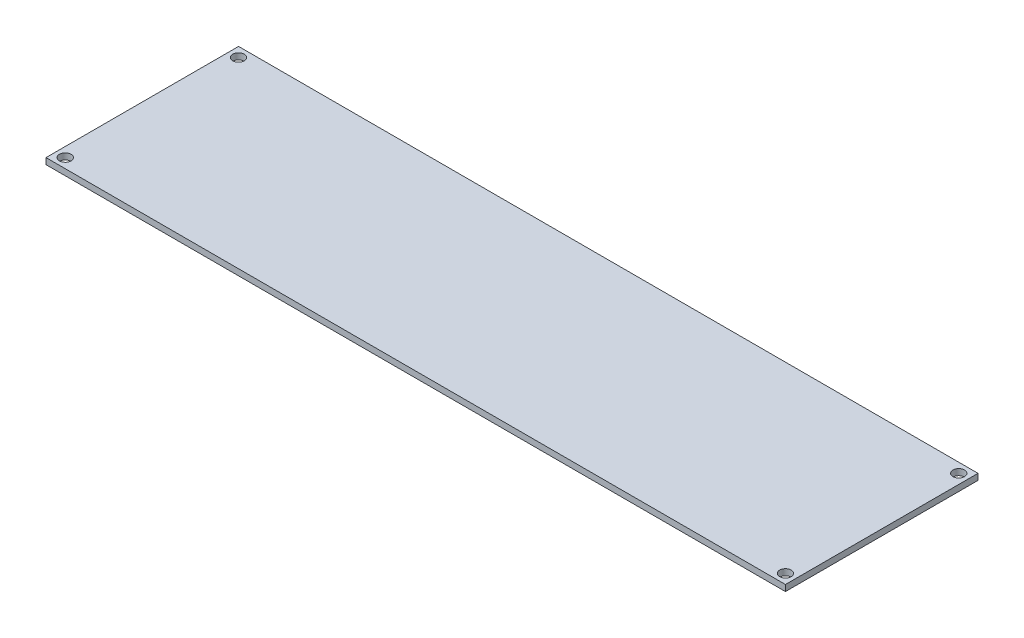
ISO-10303-21;
HEADER;
FILE_DESCRIPTION(('STEP AP214'),'2;1');
FILE_NAME('part.step','',(''),(''),'','','');
FILE_SCHEMA(('AUTOMOTIVE_DESIGN { 1 0 10303 214 1 1 1 1 }'));
ENDSEC;
DATA;
#1=APPLICATION_CONTEXT('core data for automotive mechanical design processes');
#2=APPLICATION_PROTOCOL_DEFINITION('international standard','automotive_design',2000,#1);
#3=PRODUCT_CONTEXT('',#1,'mechanical');
#4=PRODUCT('Part','Part','',(#3));
#5=PRODUCT_RELATED_PRODUCT_CATEGORY('part','',(#4));
#6=PRODUCT_DEFINITION_FORMATION('','',#4);
#7=PRODUCT_DEFINITION_CONTEXT('part definition',#1,'design');
#8=PRODUCT_DEFINITION('design','',#6,#7);
#9=PRODUCT_DEFINITION_SHAPE('','',#8);
#10=(LENGTH_UNIT() NAMED_UNIT(*) SI_UNIT(.MILLI.,.METRE.));
#11=(NAMED_UNIT(*) PLANE_ANGLE_UNIT() SI_UNIT($,.RADIAN.));
#12=(NAMED_UNIT(*) SI_UNIT($,.STERADIAN.) SOLID_ANGLE_UNIT());
#13=UNCERTAINTY_MEASURE_WITH_UNIT(LENGTH_MEASURE(1.E-05),#10,'distance_accuracy_value','');
#14=(GEOMETRIC_REPRESENTATION_CONTEXT(3) GLOBAL_UNCERTAINTY_ASSIGNED_CONTEXT((#13)) GLOBAL_UNIT_ASSIGNED_CONTEXT((#10,
#11,#12)) REPRESENTATION_CONTEXT('',''));
#15=CARTESIAN_POINT('',(0.,0.,0.));
#16=DIRECTION('',(0.,0.,1.));
#17=DIRECTION('',(1.,0.,0.));
#18=AXIS2_PLACEMENT_3D('',#15,#16,#17);
#19=CARTESIAN_POINT('',(0.,1.6,0.));
#20=DIRECTION('',(1.,0.,0.));
#21=DIRECTION('',(0.,0.,-1.));
#22=AXIS2_PLACEMENT_3D('',#19,#20,#21);
#23=PLANE('',#22);
#24=DIRECTION('',(0.,0.,1.));
#25=VECTOR('',#24,1.);
#26=CARTESIAN_POINT('',(0.,0.,0.));
#27=LINE('',#26,#25);
#28=CARTESIAN_POINT('',(0.,0.,-50.));
#29=VERTEX_POINT('',#28);
#30=CARTESIAN_POINT('',(0.,0.,0.));
#31=VERTEX_POINT('',#30);
#32=EDGE_CURVE('E96',#29,#31,#27,.T.);
#33=ORIENTED_EDGE('',*,*,#32,.T.);
#34=DIRECTION('',(0.,-1.,0.));
#35=VECTOR('',#34,1.);
#36=CARTESIAN_POINT('',(0.,1.6,0.));
#37=LINE('',#36,#35);
#38=CARTESIAN_POINT('',(0.,1.6,0.));
#39=VERTEX_POINT('',#38);
#40=EDGE_CURVE('E11',#39,#31,#37,.T.);
#41=ORIENTED_EDGE('',*,*,#40,.F.);
#42=DIRECTION('',(0.,0.,1.));
#43=VECTOR('',#42,1.);
#44=CARTESIAN_POINT('',(0.,1.6,0.));
#45=LINE('',#44,#43);
#46=CARTESIAN_POINT('',(0.,1.6,-50.));
#47=VERTEX_POINT('',#46);
#48=EDGE_CURVE('E84',#47,#39,#45,.T.);
#49=ORIENTED_EDGE('',*,*,#48,.F.);
#50=DIRECTION('',(0.,-1.,0.));
#51=VECTOR('',#50,1.);
#52=CARTESIAN_POINT('',(0.,1.6,-50.));
#53=LINE('',#52,#51);
#54=EDGE_CURVE('E92',#47,#29,#53,.T.);
#55=ORIENTED_EDGE('',*,*,#54,.T.);
#56=EDGE_LOOP('',(#33,#41,#49,#55));
#57=FACE_BOUND('',#56,.T.);
#58=ADVANCED_FACE('F33',(#57),#23,.F.);
#59=CARTESIAN_POINT('',(0.,1.6,0.));
#60=DIRECTION('',(0.,0.,-1.));
#61=DIRECTION('',(-1.,0.,0.));
#62=AXIS2_PLACEMENT_3D('',#59,#60,#61);
#63=PLANE('',#62);
#64=DIRECTION('',(1.,0.,0.));
#65=VECTOR('',#64,1.);
#66=CARTESIAN_POINT('',(0.,0.,0.));
#67=LINE('',#66,#65);
#68=CARTESIAN_POINT('',(192.,0.,0.));
#69=VERTEX_POINT('',#68);
#70=EDGE_CURVE('E88',#31,#69,#67,.T.);
#71=ORIENTED_EDGE('',*,*,#70,.T.);
#72=DIRECTION('',(0.,-1.,0.));
#73=VECTOR('',#72,1.);
#74=CARTESIAN_POINT('',(192.,1.6,0.));
#75=LINE('',#74,#73);
#76=CARTESIAN_POINT('',(192.,1.6,0.));
#77=VERTEX_POINT('',#76);
#78=EDGE_CURVE('E41',#77,#69,#75,.T.);
#79=ORIENTED_EDGE('',*,*,#78,.F.);
#80=DIRECTION('',(1.,0.,0.));
#81=VECTOR('',#80,1.);
#82=CARTESIAN_POINT('',(0.,1.6,0.));
#83=LINE('',#82,#81);
#84=EDGE_CURVE('E79',#39,#77,#83,.T.);
#85=ORIENTED_EDGE('',*,*,#84,.F.);
#86=ORIENTED_EDGE('',*,*,#40,.T.);
#87=EDGE_LOOP('',(#71,#79,#85,#86));
#88=FACE_BOUND('',#87,.T.);
#89=ADVANCED_FACE('F87',(#88),#63,.F.);
#90=CARTESIAN_POINT('',(192.,1.6,0.));
#91=DIRECTION('',(-1.,0.,0.));
#92=DIRECTION('',(0.,0.,1.));
#93=AXIS2_PLACEMENT_3D('',#90,#91,#92);
#94=PLANE('',#93);
#95=DIRECTION('',(0.,0.,-1.));
#96=VECTOR('',#95,1.);
#97=CARTESIAN_POINT('',(192.,0.,0.));
#98=LINE('',#97,#96);
#99=CARTESIAN_POINT('',(192.,0.,-50.));
#100=VERTEX_POINT('',#99);
#101=EDGE_CURVE('E66',#69,#100,#98,.T.);
#102=ORIENTED_EDGE('',*,*,#101,.T.);
#103=DIRECTION('',(0.,-1.,0.));
#104=VECTOR('',#103,1.);
#105=CARTESIAN_POINT('',(192.,1.6,-50.));
#106=LINE('',#105,#104);
#107=CARTESIAN_POINT('',(192.,1.6,-50.));
#108=VERTEX_POINT('',#107);
#109=EDGE_CURVE('E89',#108,#100,#106,.T.);
#110=ORIENTED_EDGE('',*,*,#109,.F.);
#111=DIRECTION('',(0.,0.,-1.));
#112=VECTOR('',#111,1.);
#113=CARTESIAN_POINT('',(192.,1.6,0.));
#114=LINE('',#113,#112);
#115=EDGE_CURVE('E82',#77,#108,#114,.T.);
#116=ORIENTED_EDGE('',*,*,#115,.F.);
#117=ORIENTED_EDGE('',*,*,#78,.T.);
#118=EDGE_LOOP('',(#102,#110,#116,#117));
#119=FACE_BOUND('',#118,.T.);
#120=ADVANCED_FACE('F90',(#119),#94,.F.);
#121=CARTESIAN_POINT('',(0.,1.6,-50.));
#122=DIRECTION('',(0.,0.,1.));
#123=DIRECTION('',(1.,0.,0.));
#124=AXIS2_PLACEMENT_3D('',#121,#122,#123);
#125=PLANE('',#124);
#126=DIRECTION('',(-1.,0.,0.));
#127=VECTOR('',#126,1.);
#128=CARTESIAN_POINT('',(0.,0.,-50.));
#129=LINE('',#128,#127);
#130=EDGE_CURVE('E72',#100,#29,#129,.T.);
#131=ORIENTED_EDGE('',*,*,#130,.T.);
#132=ORIENTED_EDGE('',*,*,#54,.F.);
#133=DIRECTION('',(-1.,0.,0.));
#134=VECTOR('',#133,1.);
#135=CARTESIAN_POINT('',(0.,1.6,-50.));
#136=LINE('',#135,#134);
#137=EDGE_CURVE('E49',#108,#47,#136,.T.);
#138=ORIENTED_EDGE('',*,*,#137,.F.);
#139=ORIENTED_EDGE('',*,*,#109,.T.);
#140=EDGE_LOOP('',(#131,#132,#138,#139));
#141=FACE_BOUND('',#140,.T.);
#142=ADVANCED_FACE('F104',(#141),#125,.F.);
#143=CARTESIAN_POINT('',(0.,1.6,0.));
#144=DIRECTION('',(0.,-1.,0.));
#145=DIRECTION('',(0.,0.,-1.));
#146=AXIS2_PLACEMENT_3D('',#143,#144,#145);
#147=PLANE('',#146);
#148=CARTESIAN_POINT('',(189.5,1.6,-2.5));
#149=DIRECTION('',(0.,-1.,0.));
#150=DIRECTION('',(0.,0.,-1.));
#151=AXIS2_PLACEMENT_3D('',#148,#149,#150);
#152=CIRCLE('',#151,1.5);
#153=CARTESIAN_POINT('',(189.5,1.6,-4.));
#154=VERTEX_POINT('',#153);
#155=EDGE_CURVE('E113',#154,#154,#152,.T.);
#156=ORIENTED_EDGE('',*,*,#155,.T.);
#157=EDGE_LOOP('',(#156));
#158=FACE_BOUND('',#157,.T.);
#159=CARTESIAN_POINT('',(189.5,1.6,-47.5));
#160=DIRECTION('',(0.,-1.,0.));
#161=DIRECTION('',(0.,0.,-1.));
#162=AXIS2_PLACEMENT_3D('',#159,#160,#161);
#163=CIRCLE('',#162,1.5);
#164=CARTESIAN_POINT('',(189.5,1.6,-49.));
#165=VERTEX_POINT('',#164);
#166=EDGE_CURVE('E125',#165,#165,#163,.T.);
#167=ORIENTED_EDGE('',*,*,#166,.T.);
#168=EDGE_LOOP('',(#167));
#169=FACE_BOUND('',#168,.T.);
#170=CARTESIAN_POINT('',(2.5,1.6,-47.5));
#171=DIRECTION('',(0.,-1.,0.));
#172=DIRECTION('',(0.,0.,-1.));
#173=AXIS2_PLACEMENT_3D('',#170,#171,#172);
#174=CIRCLE('',#173,1.5);
#175=CARTESIAN_POINT('',(2.5,1.6,-49.));
#176=VERTEX_POINT('',#175);
#177=EDGE_CURVE('E119',#176,#176,#174,.T.);
#178=ORIENTED_EDGE('',*,*,#177,.T.);
#179=EDGE_LOOP('',(#178));
#180=FACE_BOUND('',#179,.T.);
#181=CARTESIAN_POINT('',(2.5,1.6,-2.5));
#182=DIRECTION('',(0.,-1.,0.));
#183=DIRECTION('',(0.,0.,-1.));
#184=AXIS2_PLACEMENT_3D('',#181,#182,#183);
#185=CIRCLE('',#184,1.5);
#186=CARTESIAN_POINT('',(2.5,1.6,-4.));
#187=VERTEX_POINT('',#186);
#188=EDGE_CURVE('E99',#187,#187,#185,.T.);
#189=ORIENTED_EDGE('',*,*,#188,.T.);
#190=EDGE_LOOP('',(#189));
#191=FACE_BOUND('',#190,.T.);
#192=ORIENTED_EDGE('',*,*,#48,.T.);
#193=ORIENTED_EDGE('',*,*,#84,.T.);
#194=ORIENTED_EDGE('',*,*,#115,.T.);
#195=ORIENTED_EDGE('',*,*,#137,.T.);
#196=EDGE_LOOP('',(#192,#193,#194,#195));
#197=FACE_BOUND('',#196,.T.);
#198=ADVANCED_FACE('F80',(#158,#169,#180,#191,#197),#147,.F.);
#199=CARTESIAN_POINT('',(0.,0.,0.));
#200=DIRECTION('',(0.,-1.,0.));
#201=DIRECTION('',(0.,0.,-1.));
#202=AXIS2_PLACEMENT_3D('',#199,#200,#201);
#203=PLANE('',#202);
#204=CARTESIAN_POINT('',(189.5,0.,-2.5));
#205=DIRECTION('',(0.,-1.,0.));
#206=DIRECTION('',(0.,0.,-1.));
#207=AXIS2_PLACEMENT_3D('',#204,#205,#206);
#208=CIRCLE('',#207,1.5);
#209=CARTESIAN_POINT('',(189.5,0.,-4.));
#210=VERTEX_POINT('',#209);
#211=EDGE_CURVE('E128',#210,#210,#208,.T.);
#212=ORIENTED_EDGE('',*,*,#211,.F.);
#213=EDGE_LOOP('',(#212));
#214=FACE_BOUND('',#213,.T.);
#215=CARTESIAN_POINT('',(189.5,0.,-47.5));
#216=DIRECTION('',(0.,-1.,0.));
#217=DIRECTION('',(0.,0.,-1.));
#218=AXIS2_PLACEMENT_3D('',#215,#216,#217);
#219=CIRCLE('',#218,1.5);
#220=CARTESIAN_POINT('',(189.5,0.,-49.));
#221=VERTEX_POINT('',#220);
#222=EDGE_CURVE('E122',#221,#221,#219,.T.);
#223=ORIENTED_EDGE('',*,*,#222,.F.);
#224=EDGE_LOOP('',(#223));
#225=FACE_BOUND('',#224,.T.);
#226=CARTESIAN_POINT('',(2.5,0.,-47.5));
#227=DIRECTION('',(0.,-1.,0.));
#228=DIRECTION('',(0.,0.,-1.));
#229=AXIS2_PLACEMENT_3D('',#226,#227,#228);
#230=CIRCLE('',#229,1.5);
#231=CARTESIAN_POINT('',(2.5,0.,-49.));
#232=VERTEX_POINT('',#231);
#233=EDGE_CURVE('E116',#232,#232,#230,.T.);
#234=ORIENTED_EDGE('',*,*,#233,.F.);
#235=EDGE_LOOP('',(#234));
#236=FACE_BOUND('',#235,.T.);
#237=CARTESIAN_POINT('',(2.5,0.,-2.5));
#238=DIRECTION('',(0.,-1.,0.));
#239=DIRECTION('',(0.,0.,-1.));
#240=AXIS2_PLACEMENT_3D('',#237,#238,#239);
#241=CIRCLE('',#240,1.5);
#242=CARTESIAN_POINT('',(2.5,0.,-4.));
#243=VERTEX_POINT('',#242);
#244=EDGE_CURVE('E110',#243,#243,#241,.T.);
#245=ORIENTED_EDGE('',*,*,#244,.F.);
#246=EDGE_LOOP('',(#245));
#247=FACE_BOUND('',#246,.T.);
#248=ORIENTED_EDGE('',*,*,#32,.F.);
#249=ORIENTED_EDGE('',*,*,#130,.F.);
#250=ORIENTED_EDGE('',*,*,#101,.F.);
#251=ORIENTED_EDGE('',*,*,#70,.F.);
#252=EDGE_LOOP('',(#248,#249,#250,#251));
#253=FACE_BOUND('',#252,.T.);
#254=ADVANCED_FACE('F107',(#214,#225,#236,#247,#253),#203,.T.);
#255=CARTESIAN_POINT('',(2.5,1.6,-2.5));
#256=DIRECTION('',(0.,-1.,0.));
#257=DIRECTION('',(0.,0.,-1.));
#258=AXIS2_PLACEMENT_3D('',#255,#256,#257);
#259=CYLINDRICAL_SURFACE('',#258,1.5);
#260=ORIENTED_EDGE('',*,*,#188,.F.);
#261=EDGE_LOOP('',(#260));
#262=FACE_BOUND('',#261,.T.);
#263=ORIENTED_EDGE('',*,*,#244,.T.);
#264=EDGE_LOOP('',(#263));
#265=FACE_BOUND('',#264,.T.);
#266=ADVANCED_FACE('F145',(#262,#265),#259,.F.);
#267=CARTESIAN_POINT('',(2.5,1.6,-47.5));
#268=DIRECTION('',(0.,-1.,0.));
#269=DIRECTION('',(0.,0.,-1.));
#270=AXIS2_PLACEMENT_3D('',#267,#268,#269);
#271=CYLINDRICAL_SURFACE('',#270,1.5);
#272=ORIENTED_EDGE('',*,*,#177,.F.);
#273=EDGE_LOOP('',(#272));
#274=FACE_BOUND('',#273,.T.);
#275=ORIENTED_EDGE('',*,*,#233,.T.);
#276=EDGE_LOOP('',(#275));
#277=FACE_BOUND('',#276,.T.);
#278=ADVANCED_FACE('F154',(#274,#277),#271,.F.);
#279=CARTESIAN_POINT('',(189.5,1.6,-47.5));
#280=DIRECTION('',(0.,-1.,0.));
#281=DIRECTION('',(0.,0.,-1.));
#282=AXIS2_PLACEMENT_3D('',#279,#280,#281);
#283=CYLINDRICAL_SURFACE('',#282,1.5);
#284=ORIENTED_EDGE('',*,*,#166,.F.);
#285=EDGE_LOOP('',(#284));
#286=FACE_BOUND('',#285,.T.);
#287=ORIENTED_EDGE('',*,*,#222,.T.);
#288=EDGE_LOOP('',(#287));
#289=FACE_BOUND('',#288,.T.);
#290=ADVANCED_FACE('F139',(#286,#289),#283,.F.);
#291=CARTESIAN_POINT('',(189.5,1.6,-2.5));
#292=DIRECTION('',(0.,-1.,0.));
#293=DIRECTION('',(0.,0.,-1.));
#294=AXIS2_PLACEMENT_3D('',#291,#292,#293);
#295=CYLINDRICAL_SURFACE('',#294,1.5);
#296=ORIENTED_EDGE('',*,*,#155,.F.);
#297=EDGE_LOOP('',(#296));
#298=FACE_BOUND('',#297,.T.);
#299=ORIENTED_EDGE('',*,*,#211,.T.);
#300=EDGE_LOOP('',(#299));
#301=FACE_BOUND('',#300,.T.);
#302=ADVANCED_FACE('F136',(#298,#301),#295,.F.);
#303=CLOSED_SHELL('',(#58,#89,#120,#142,#198,#254,#266,#278,#290,#302));
#304=MANIFOLD_SOLID_BREP('B2',#303);
#305=ADVANCED_BREP_SHAPE_REPRESENTATION('',(#18,#304),#14);
#306=SHAPE_DEFINITION_REPRESENTATION(#9,#305);
ENDSEC;
END-ISO-10303-21;
